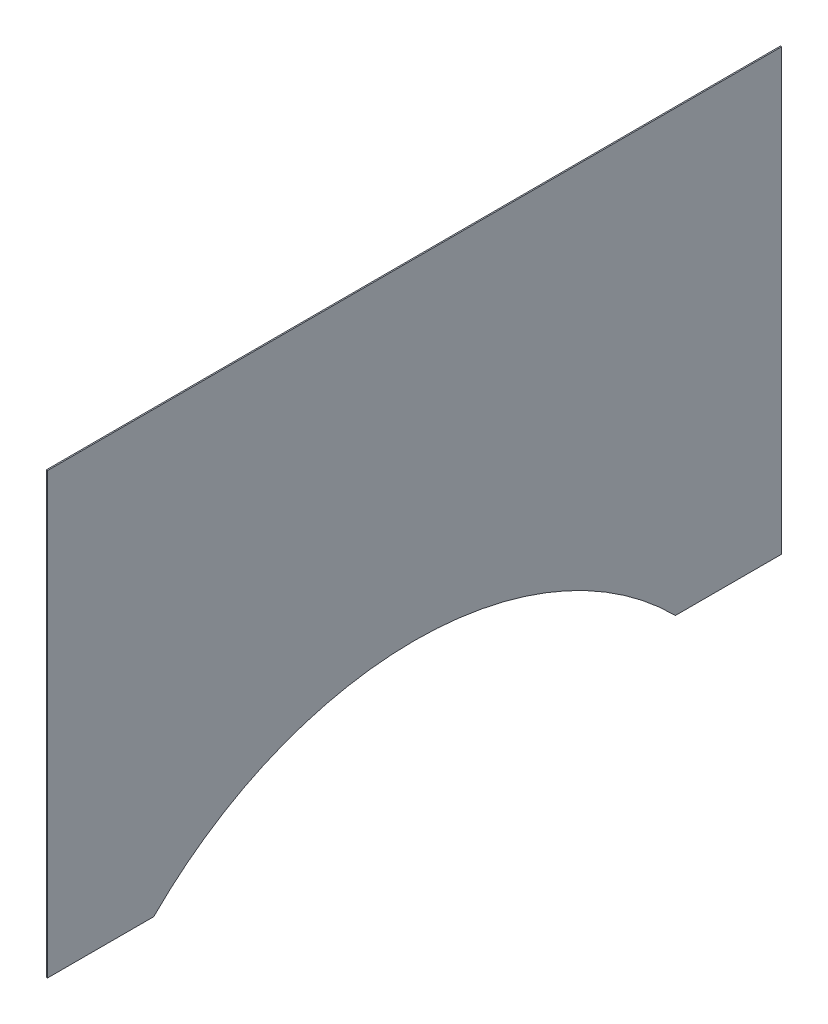
ISO-10303-21;
HEADER;
FILE_DESCRIPTION(('STEP AP214'),'2;1');
FILE_NAME('part.step','',(''),(''),'','','');
FILE_SCHEMA(('AUTOMOTIVE_DESIGN { 1 0 10303 214 1 1 1 1 }'));
ENDSEC;
DATA;
#1=APPLICATION_CONTEXT('core data for automotive mechanical design processes');
#2=APPLICATION_PROTOCOL_DEFINITION('international standard','automotive_design',2000,#1);
#3=PRODUCT_CONTEXT('',#1,'mechanical');
#4=PRODUCT('Part','Part','',(#3));
#5=PRODUCT_RELATED_PRODUCT_CATEGORY('part','',(#4));
#6=PRODUCT_DEFINITION_FORMATION('','',#4);
#7=PRODUCT_DEFINITION_CONTEXT('part definition',#1,'design');
#8=PRODUCT_DEFINITION('design','',#6,#7);
#9=PRODUCT_DEFINITION_SHAPE('','',#8);
#10=(LENGTH_UNIT() NAMED_UNIT(*) SI_UNIT(.MILLI.,.METRE.));
#11=(NAMED_UNIT(*) PLANE_ANGLE_UNIT() SI_UNIT($,.RADIAN.));
#12=(NAMED_UNIT(*) SI_UNIT($,.STERADIAN.) SOLID_ANGLE_UNIT());
#13=UNCERTAINTY_MEASURE_WITH_UNIT(LENGTH_MEASURE(1.E-05),#10,'distance_accuracy_value','');
#14=(GEOMETRIC_REPRESENTATION_CONTEXT(3) GLOBAL_UNCERTAINTY_ASSIGNED_CONTEXT((#13)) GLOBAL_UNIT_ASSIGNED_CONTEXT((#10,
#11,#12)) REPRESENTATION_CONTEXT('',''));
#15=CARTESIAN_POINT('',(0.,0.,0.));
#16=DIRECTION('',(0.,0.,1.));
#17=DIRECTION('',(1.,0.,0.));
#18=AXIS2_PLACEMENT_3D('',#15,#16,#17);
#19=CARTESIAN_POINT('',(0.79375,-71.5042771445641,241.3));
#20=DIRECTION('',(0.,0.,-1.));
#21=DIRECTION('',(-1.,0.,0.));
#22=AXIS2_PLACEMENT_3D('',#19,#20,#21);
#23=PLANE('',#22);
#24=DIRECTION('',(0.,-1.,0.));
#25=VECTOR('',#24,1.);
#26=CARTESIAN_POINT('',(0.,-71.5042771445641,241.3));
#27=LINE('',#26,#25);
#28=CARTESIAN_POINT('',(0.,217.420722855436,241.3));
#29=VERTEX_POINT('',#28);
#30=CARTESIAN_POINT('',(0.,-71.5042771445641,241.3));
#31=VERTEX_POINT('',#30);
#32=EDGE_CURVE('E117',#29,#31,#27,.T.);
#33=ORIENTED_EDGE('',*,*,#32,.T.);
#34=DIRECTION('',(-1.,0.,0.));
#35=VECTOR('',#34,1.);
#36=CARTESIAN_POINT('',(0.79375,-71.5042771445641,241.3));
#37=LINE('',#36,#35);
#38=CARTESIAN_POINT('',(0.79375,-71.5042771445641,241.3));
#39=VERTEX_POINT('',#38);
#40=EDGE_CURVE('E11',#39,#31,#37,.T.);
#41=ORIENTED_EDGE('',*,*,#40,.F.);
#42=DIRECTION('',(0.,-1.,0.));
#43=VECTOR('',#42,1.);
#44=CARTESIAN_POINT('',(0.79375,-71.5042771445641,241.3));
#45=LINE('',#44,#43);
#46=CARTESIAN_POINT('',(0.79375,217.420722855436,241.3));
#47=VERTEX_POINT('',#46);
#48=EDGE_CURVE('E127',#47,#39,#45,.T.);
#49=ORIENTED_EDGE('',*,*,#48,.F.);
#50=DIRECTION('',(-1.,0.,0.));
#51=VECTOR('',#50,1.);
#52=CARTESIAN_POINT('',(0.79375,217.420722855436,241.3));
#53=LINE('',#52,#51);
#54=EDGE_CURVE('E113',#47,#29,#53,.T.);
#55=ORIENTED_EDGE('',*,*,#54,.T.);
#56=EDGE_LOOP('',(#33,#41,#49,#55));
#57=FACE_BOUND('',#56,.T.);
#58=ADVANCED_FACE('F33',(#57),#23,.F.);
#59=CARTESIAN_POINT('',(0.79375,-71.5042771445641,171.45));
#60=DIRECTION('',(0.,1.,0.));
#61=DIRECTION('',(0.,0.,1.));
#62=AXIS2_PLACEMENT_3D('',#59,#60,#61);
#63=PLANE('',#62);
#64=DIRECTION('',(0.,0.,-1.));
#65=VECTOR('',#64,1.);
#66=CARTESIAN_POINT('',(0.,-71.5042771445641,171.45));
#67=LINE('',#66,#65);
#68=CARTESIAN_POINT('',(0.,-71.5042771445641,171.45));
#69=VERTEX_POINT('',#68);
#70=EDGE_CURVE('E120',#31,#69,#67,.T.);
#71=ORIENTED_EDGE('',*,*,#70,.T.);
#72=DIRECTION('',(-1.,0.,0.));
#73=VECTOR('',#72,1.);
#74=CARTESIAN_POINT('',(0.79375,-71.5042771445641,171.45));
#75=LINE('',#74,#73);
#76=CARTESIAN_POINT('',(0.79375,-71.5042771445641,171.45));
#77=VERTEX_POINT('',#76);
#78=EDGE_CURVE('E41',#77,#69,#75,.T.);
#79=ORIENTED_EDGE('',*,*,#78,.F.);
#80=DIRECTION('',(0.,0.,-1.));
#81=VECTOR('',#80,1.);
#82=CARTESIAN_POINT('',(0.79375,-71.5042771445641,171.45));
#83=LINE('',#82,#81);
#84=EDGE_CURVE('E86',#39,#77,#83,.T.);
#85=ORIENTED_EDGE('',*,*,#84,.F.);
#86=ORIENTED_EDGE('',*,*,#40,.T.);
#87=EDGE_LOOP('',(#71,#79,#85,#86));
#88=FACE_BOUND('',#87,.T.);
#89=ADVANCED_FACE('F151',(#88),#63,.F.);
#90=CARTESIAN_POINT('',(0.79375,-241.3,0.));
#91=DIRECTION('',(-1.,0.,0.));
#92=DIRECTION('',(0.,0.,1.));
#93=AXIS2_PLACEMENT_3D('',#90,#91,#92);
#94=CYLINDRICAL_SURFACE('',#93,241.3);
#95=CARTESIAN_POINT('',(0.,-241.3,0.));
#96=DIRECTION('',(-1.,0.,0.));
#97=DIRECTION('',(0.,0.,-1.));
#98=AXIS2_PLACEMENT_3D('',#95,#96,#97);
#99=CIRCLE('',#98,241.3);
#100=CARTESIAN_POINT('',(0.,-71.5042771445641,-171.45));
#101=VERTEX_POINT('',#100);
#102=EDGE_CURVE('E122',#69,#101,#99,.T.);
#103=ORIENTED_EDGE('',*,*,#102,.T.);
#104=DIRECTION('',(-1.,0.,0.));
#105=VECTOR('',#104,1.);
#106=CARTESIAN_POINT('',(0.79375,-71.5042771445641,-171.45));
#107=LINE('',#106,#105);
#108=CARTESIAN_POINT('',(0.79375,-71.5042771445641,-171.45));
#109=VERTEX_POINT('',#108);
#110=EDGE_CURVE('E108',#109,#101,#107,.T.);
#111=ORIENTED_EDGE('',*,*,#110,.F.);
#112=CARTESIAN_POINT('',(0.79375,-241.3,0.));
#113=DIRECTION('',(-1.,0.,0.));
#114=DIRECTION('',(0.,0.,-1.));
#115=AXIS2_PLACEMENT_3D('',#112,#113,#114);
#116=CIRCLE('',#115,241.3);
#117=EDGE_CURVE('E99',#77,#109,#116,.T.);
#118=ORIENTED_EDGE('',*,*,#117,.F.);
#119=ORIENTED_EDGE('',*,*,#78,.T.);
#120=EDGE_LOOP('',(#103,#111,#118,#119));
#121=FACE_BOUND('',#120,.T.);
#122=ADVANCED_FACE('F133',(#121),#94,.F.);
#123=CARTESIAN_POINT('',(0.79375,-71.5042771445641,-241.3));
#124=DIRECTION('',(0.,1.,0.));
#125=DIRECTION('',(0.,0.,1.));
#126=AXIS2_PLACEMENT_3D('',#123,#124,#125);
#127=PLANE('',#126);
#128=DIRECTION('',(0.,0.,-1.));
#129=VECTOR('',#128,1.);
#130=CARTESIAN_POINT('',(0.,-71.5042771445641,-241.3));
#131=LINE('',#130,#129);
#132=CARTESIAN_POINT('',(0.,-71.5042771445641,-241.3));
#133=VERTEX_POINT('',#132);
#134=EDGE_CURVE('E107',#101,#133,#131,.T.);
#135=ORIENTED_EDGE('',*,*,#134,.T.);
#136=DIRECTION('',(-1.,0.,0.));
#137=VECTOR('',#136,1.);
#138=CARTESIAN_POINT('',(0.79375,-71.5042771445641,-241.3));
#139=LINE('',#138,#137);
#140=CARTESIAN_POINT('',(0.79375,-71.5042771445641,-241.3));
#141=VERTEX_POINT('',#140);
#142=EDGE_CURVE('E104',#141,#133,#139,.T.);
#143=ORIENTED_EDGE('',*,*,#142,.F.);
#144=DIRECTION('',(0.,0.,-1.));
#145=VECTOR('',#144,1.);
#146=CARTESIAN_POINT('',(0.79375,-71.5042771445641,-241.3));
#147=LINE('',#146,#145);
#148=EDGE_CURVE('E93',#109,#141,#147,.T.);
#149=ORIENTED_EDGE('',*,*,#148,.F.);
#150=ORIENTED_EDGE('',*,*,#110,.T.);
#151=EDGE_LOOP('',(#135,#143,#149,#150));
#152=FACE_BOUND('',#151,.T.);
#153=ADVANCED_FACE('F105',(#152),#127,.F.);
#154=CARTESIAN_POINT('',(0.79375,217.420722855436,-241.3));
#155=DIRECTION('',(0.,0.,1.));
#156=DIRECTION('',(1.,0.,0.));
#157=AXIS2_PLACEMENT_3D('',#154,#155,#156);
#158=PLANE('',#157);
#159=DIRECTION('',(0.,1.,0.));
#160=VECTOR('',#159,1.);
#161=CARTESIAN_POINT('',(0.,217.420722855436,-241.3));
#162=LINE('',#161,#160);
#163=CARTESIAN_POINT('',(0.,217.420722855436,-241.3));
#164=VERTEX_POINT('',#163);
#165=EDGE_CURVE('E72',#133,#164,#162,.T.);
#166=ORIENTED_EDGE('',*,*,#165,.T.);
#167=DIRECTION('',(-1.,0.,0.));
#168=VECTOR('',#167,1.);
#169=CARTESIAN_POINT('',(0.79375,217.420722855436,-241.3));
#170=LINE('',#169,#168);
#171=CARTESIAN_POINT('',(0.79375,217.420722855436,-241.3));
#172=VERTEX_POINT('',#171);
#173=EDGE_CURVE('E109',#172,#164,#170,.T.);
#174=ORIENTED_EDGE('',*,*,#173,.F.);
#175=DIRECTION('',(0.,1.,0.));
#176=VECTOR('',#175,1.);
#177=CARTESIAN_POINT('',(0.79375,217.420722855436,-241.3));
#178=LINE('',#177,#176);
#179=EDGE_CURVE('E97',#141,#172,#178,.T.);
#180=ORIENTED_EDGE('',*,*,#179,.F.);
#181=ORIENTED_EDGE('',*,*,#142,.T.);
#182=EDGE_LOOP('',(#166,#174,#180,#181));
#183=FACE_BOUND('',#182,.T.);
#184=ADVANCED_FACE('F111',(#183),#158,.F.);
#185=CARTESIAN_POINT('',(0.79375,217.420722855436,241.3));
#186=DIRECTION('',(0.,-1.,0.));
#187=DIRECTION('',(0.,0.,-1.));
#188=AXIS2_PLACEMENT_3D('',#185,#186,#187);
#189=PLANE('',#188);
#190=DIRECTION('',(0.,0.,1.));
#191=VECTOR('',#190,1.);
#192=CARTESIAN_POINT('',(0.,217.420722855436,241.3));
#193=LINE('',#192,#191);
#194=EDGE_CURVE('E78',#164,#29,#193,.T.);
#195=ORIENTED_EDGE('',*,*,#194,.T.);
#196=ORIENTED_EDGE('',*,*,#54,.F.);
#197=DIRECTION('',(0.,0.,1.));
#198=VECTOR('',#197,1.);
#199=CARTESIAN_POINT('',(0.79375,217.420722855436,241.3));
#200=LINE('',#199,#198);
#201=EDGE_CURVE('E49',#172,#47,#200,.T.);
#202=ORIENTED_EDGE('',*,*,#201,.F.);
#203=ORIENTED_EDGE('',*,*,#173,.T.);
#204=EDGE_LOOP('',(#195,#196,#202,#203));
#205=FACE_BOUND('',#204,.T.);
#206=ADVANCED_FACE('F140',(#205),#189,.F.);
#207=CARTESIAN_POINT('',(0.79375,-241.3,0.));
#208=DIRECTION('',(1.,0.,0.));
#209=DIRECTION('',(0.,0.,-1.));
#210=AXIS2_PLACEMENT_3D('',#207,#208,#209);
#211=PLANE('',#210);
#212=ORIENTED_EDGE('',*,*,#48,.T.);
#213=ORIENTED_EDGE('',*,*,#84,.T.);
#214=ORIENTED_EDGE('',*,*,#117,.T.);
#215=ORIENTED_EDGE('',*,*,#148,.T.);
#216=ORIENTED_EDGE('',*,*,#179,.T.);
#217=ORIENTED_EDGE('',*,*,#201,.T.);
#218=EDGE_LOOP('',(#212,#213,#214,#215,#216,#217));
#219=FACE_BOUND('',#218,.T.);
#220=ADVANCED_FACE('F95',(#219),#211,.T.);
#221=CARTESIAN_POINT('',(0.,-241.3,0.));
#222=DIRECTION('',(1.,0.,0.));
#223=DIRECTION('',(0.,0.,-1.));
#224=AXIS2_PLACEMENT_3D('',#221,#222,#223);
#225=PLANE('',#224);
#226=ORIENTED_EDGE('',*,*,#32,.F.);
#227=ORIENTED_EDGE('',*,*,#194,.F.);
#228=ORIENTED_EDGE('',*,*,#165,.F.);
#229=ORIENTED_EDGE('',*,*,#134,.F.);
#230=ORIENTED_EDGE('',*,*,#102,.F.);
#231=ORIENTED_EDGE('',*,*,#70,.F.);
#232=EDGE_LOOP('',(#226,#227,#228,#229,#230,#231));
#233=FACE_BOUND('',#232,.T.);
#234=ADVANCED_FACE('F136',(#233),#225,.F.);
#235=CLOSED_SHELL('',(#58,#89,#122,#153,#184,#206,#220,#234));
#236=MANIFOLD_SOLID_BREP('B2',#235);
#237=ADVANCED_BREP_SHAPE_REPRESENTATION('',(#18,#236),#14);
#238=SHAPE_DEFINITION_REPRESENTATION(#9,#237);
ENDSEC;
END-ISO-10303-21;
